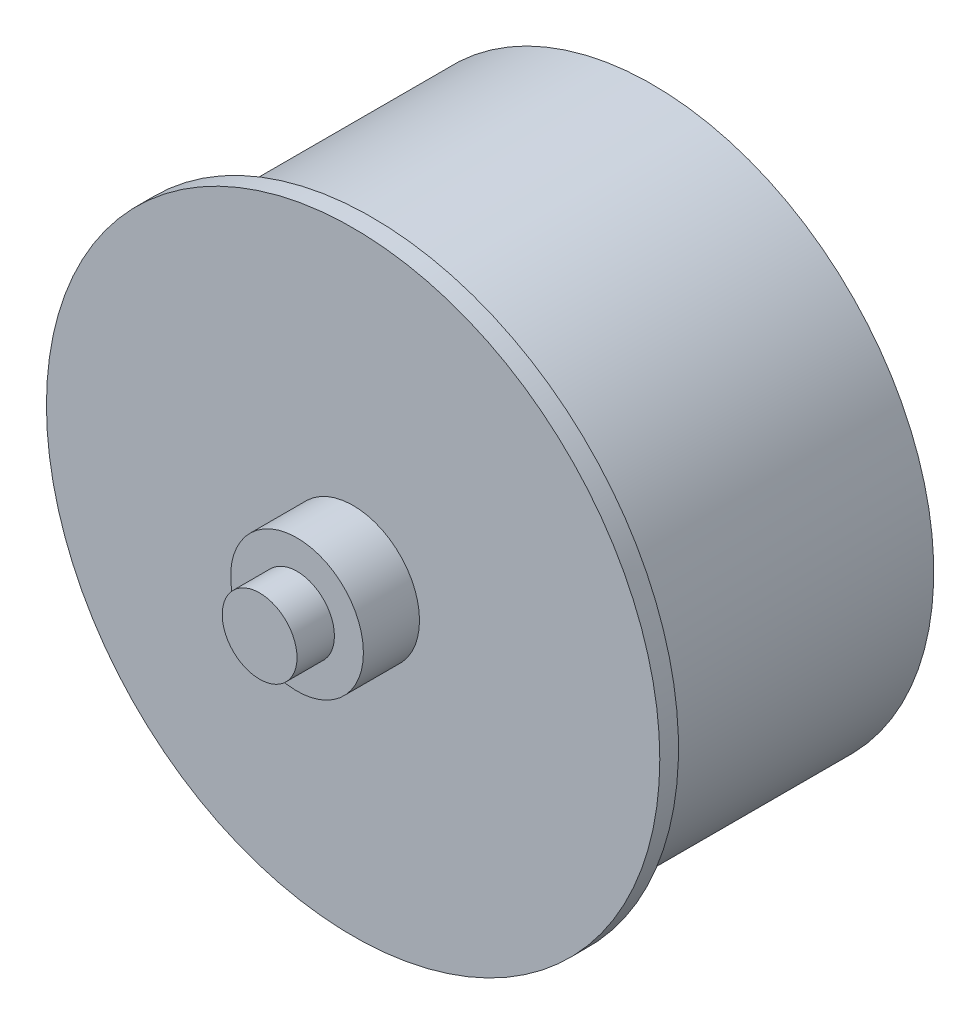
ISO-10303-21;
HEADER;
FILE_DESCRIPTION(('STEP AP214'),'2;1');
FILE_NAME('part.step','',(''),(''),'','','');
FILE_SCHEMA(('AUTOMOTIVE_DESIGN { 1 0 10303 214 1 1 1 1 }'));
ENDSEC;
DATA;
#1=APPLICATION_CONTEXT('core data for automotive mechanical design processes');
#2=APPLICATION_PROTOCOL_DEFINITION('international standard','automotive_design',2000,#1);
#3=PRODUCT_CONTEXT('',#1,'mechanical');
#4=PRODUCT('Part','Part','',(#3));
#5=PRODUCT_RELATED_PRODUCT_CATEGORY('part','',(#4));
#6=PRODUCT_DEFINITION_FORMATION('','',#4);
#7=PRODUCT_DEFINITION_CONTEXT('part definition',#1,'design');
#8=PRODUCT_DEFINITION('design','',#6,#7);
#9=PRODUCT_DEFINITION_SHAPE('','',#8);
#10=(LENGTH_UNIT() NAMED_UNIT(*) SI_UNIT(.MILLI.,.METRE.));
#11=(NAMED_UNIT(*) PLANE_ANGLE_UNIT() SI_UNIT($,.RADIAN.));
#12=(NAMED_UNIT(*) SI_UNIT($,.STERADIAN.) SOLID_ANGLE_UNIT());
#13=UNCERTAINTY_MEASURE_WITH_UNIT(LENGTH_MEASURE(1.E-05),#10,'distance_accuracy_value','');
#14=(GEOMETRIC_REPRESENTATION_CONTEXT(3) GLOBAL_UNCERTAINTY_ASSIGNED_CONTEXT((#13)) GLOBAL_UNIT_ASSIGNED_CONTEXT((#10,
#11,#12)) REPRESENTATION_CONTEXT('',''));
#15=CARTESIAN_POINT('',(0.,0.,0.));
#16=DIRECTION('',(0.,0.,1.));
#17=DIRECTION('',(1.,0.,0.));
#18=AXIS2_PLACEMENT_3D('',#15,#16,#17);
#19=CARTESIAN_POINT('',(0.,0.,-2.));
#20=DIRECTION('',(0.,0.,1.));
#21=DIRECTION('',(1.,0.,0.));
#22=AXIS2_PLACEMENT_3D('',#19,#20,#21);
#23=CYLINDRICAL_SURFACE('',#22,10.075);
#24=CARTESIAN_POINT('',(0.,0.,0.));
#25=DIRECTION('',(0.,0.,-1.));
#26=DIRECTION('',(-1.,0.,0.));
#27=AXIS2_PLACEMENT_3D('',#24,#25,#26);
#28=CIRCLE('',#27,10.075);
#29=CARTESIAN_POINT('',(-10.075,0.,0.));
#30=VERTEX_POINT('',#29);
#31=EDGE_CURVE('E11',#30,#30,#28,.T.);
#32=ORIENTED_EDGE('',*,*,#31,.T.);
#33=EDGE_LOOP('',(#32));
#34=FACE_BOUND('',#33,.T.);
#35=CARTESIAN_POINT('',(0.,0.,-1.));
#36=DIRECTION('',(0.,0.,-1.));
#37=DIRECTION('',(-1.,0.,0.));
#38=AXIS2_PLACEMENT_3D('',#35,#36,#37);
#39=CIRCLE('',#38,10.075);
#40=CARTESIAN_POINT('',(-10.075,0.,-1.));
#41=VERTEX_POINT('',#40);
#42=EDGE_CURVE('E87',#41,#41,#39,.T.);
#43=ORIENTED_EDGE('',*,*,#42,.F.);
#44=EDGE_LOOP('',(#43));
#45=FACE_BOUND('',#44,.T.);
#46=ADVANCED_FACE('F44',(#34,#45),#23,.T.);
#47=CARTESIAN_POINT('',(8.,0.,8.));
#48=DIRECTION('',(0.,0.,-1.));
#49=DIRECTION('',(-1.,0.,0.));
#50=AXIS2_PLACEMENT_3D('',#47,#48,#49);
#51=CYLINDRICAL_SURFACE('',#50,1.05);
#52=CARTESIAN_POINT('',(8.,0.,0.));
#53=DIRECTION('',(0.,0.,-1.));
#54=DIRECTION('',(-1.,0.,0.));
#55=AXIS2_PLACEMENT_3D('',#52,#53,#54);
#56=CIRCLE('',#55,1.05);
#57=CARTESIAN_POINT('',(6.95,0.,0.));
#58=VERTEX_POINT('',#57);
#59=EDGE_CURVE('E61',#58,#58,#56,.T.);
#60=ORIENTED_EDGE('',*,*,#59,.F.);
#61=EDGE_LOOP('',(#60));
#62=FACE_BOUND('',#61,.T.);
#63=CARTESIAN_POINT('',(8.,0.,-1.));
#64=DIRECTION('',(0.,0.,-1.));
#65=DIRECTION('',(-1.,0.,0.));
#66=AXIS2_PLACEMENT_3D('',#63,#64,#65);
#67=CIRCLE('',#66,1.05);
#68=CARTESIAN_POINT('',(6.95,0.,-1.));
#69=VERTEX_POINT('',#68);
#70=EDGE_CURVE('E59',#69,#69,#67,.F.);
#71=ORIENTED_EDGE('',*,*,#70,.F.);
#72=EDGE_LOOP('',(#71));
#73=FACE_BOUND('',#72,.T.);
#74=ADVANCED_FACE('F96',(#62,#73),#51,.F.);
#75=CARTESIAN_POINT('',(0.,-8.,8.));
#76=DIRECTION('',(0.,0.,-1.));
#77=DIRECTION('',(-1.,0.,0.));
#78=AXIS2_PLACEMENT_3D('',#75,#76,#77);
#79=CYLINDRICAL_SURFACE('',#78,1.05);
#80=CARTESIAN_POINT('',(0.,-8.,0.));
#81=DIRECTION('',(0.,0.,-1.));
#82=DIRECTION('',(-1.,0.,0.));
#83=AXIS2_PLACEMENT_3D('',#80,#81,#82);
#84=CIRCLE('',#83,1.05);
#85=CARTESIAN_POINT('',(-1.04999999999994,-8.,0.));
#86=VERTEX_POINT('',#85);
#87=EDGE_CURVE('E64',#86,#86,#84,.T.);
#88=ORIENTED_EDGE('',*,*,#87,.F.);
#89=EDGE_LOOP('',(#88));
#90=FACE_BOUND('',#89,.T.);
#91=CARTESIAN_POINT('',(0.,-8.,-1.));
#92=DIRECTION('',(0.,0.,-1.));
#93=DIRECTION('',(-1.,0.,0.));
#94=AXIS2_PLACEMENT_3D('',#91,#92,#93);
#95=CIRCLE('',#94,1.05);
#96=CARTESIAN_POINT('',(-1.04999999999994,-8.,-1.));
#97=VERTEX_POINT('',#96);
#98=EDGE_CURVE('E83',#97,#97,#95,.F.);
#99=ORIENTED_EDGE('',*,*,#98,.F.);
#100=EDGE_LOOP('',(#99));
#101=FACE_BOUND('',#100,.T.);
#102=ADVANCED_FACE('F77',(#90,#101),#79,.F.);
#103=CARTESIAN_POINT('',(-8.,0.,8.));
#104=DIRECTION('',(0.,0.,-1.));
#105=DIRECTION('',(-1.,0.,0.));
#106=AXIS2_PLACEMENT_3D('',#103,#104,#105);
#107=CYLINDRICAL_SURFACE('',#106,1.05);
#108=CARTESIAN_POINT('',(-8.,0.,0.));
#109=DIRECTION('',(0.,0.,-1.));
#110=DIRECTION('',(-1.,0.,0.));
#111=AXIS2_PLACEMENT_3D('',#108,#109,#110);
#112=CIRCLE('',#111,1.05);
#113=CARTESIAN_POINT('',(-9.05,0.,0.));
#114=VERTEX_POINT('',#113);
#115=EDGE_CURVE('E56',#114,#114,#112,.T.);
#116=ORIENTED_EDGE('',*,*,#115,.F.);
#117=EDGE_LOOP('',(#116));
#118=FACE_BOUND('',#117,.T.);
#119=CARTESIAN_POINT('',(-8.,0.,-1.));
#120=DIRECTION('',(0.,0.,-1.));
#121=DIRECTION('',(-1.,0.,0.));
#122=AXIS2_PLACEMENT_3D('',#119,#120,#121);
#123=CIRCLE('',#122,1.05);
#124=CARTESIAN_POINT('',(-9.05,0.,-1.));
#125=VERTEX_POINT('',#124);
#126=EDGE_CURVE('E81',#125,#125,#123,.F.);
#127=ORIENTED_EDGE('',*,*,#126,.F.);
#128=EDGE_LOOP('',(#127));
#129=FACE_BOUND('',#128,.T.);
#130=ADVANCED_FACE('F73',(#118,#129),#107,.F.);
#131=CARTESIAN_POINT('',(0.,8.,8.));
#132=DIRECTION('',(0.,0.,-1.));
#133=DIRECTION('',(-1.,0.,0.));
#134=AXIS2_PLACEMENT_3D('',#131,#132,#133);
#135=CYLINDRICAL_SURFACE('',#134,1.05);
#136=CARTESIAN_POINT('',(0.,8.,0.));
#137=DIRECTION('',(0.,0.,-1.));
#138=DIRECTION('',(-1.,0.,0.));
#139=AXIS2_PLACEMENT_3D('',#136,#137,#138);
#140=CIRCLE('',#139,1.05);
#141=CARTESIAN_POINT('',(-1.05,8.,0.));
#142=VERTEX_POINT('',#141);
#143=EDGE_CURVE('E51',#142,#142,#140,.T.);
#144=ORIENTED_EDGE('',*,*,#143,.F.);
#145=EDGE_LOOP('',(#144));
#146=FACE_BOUND('',#145,.T.);
#147=CARTESIAN_POINT('',(0.,8.,-1.));
#148=DIRECTION('',(0.,0.,-1.));
#149=DIRECTION('',(-1.,0.,0.));
#150=AXIS2_PLACEMENT_3D('',#147,#148,#149);
#151=CIRCLE('',#150,1.05);
#152=CARTESIAN_POINT('',(-1.05,8.,-1.));
#153=VERTEX_POINT('',#152);
#154=EDGE_CURVE('E47',#153,#153,#151,.F.);
#155=ORIENTED_EDGE('',*,*,#154,.F.);
#156=EDGE_LOOP('',(#155));
#157=FACE_BOUND('',#156,.T.);
#158=ADVANCED_FACE('F76',(#146,#157),#135,.F.);
#159=CARTESIAN_POINT('',(0.,0.,0.));
#160=DIRECTION('',(0.,0.,-1.));
#161=DIRECTION('',(-1.,0.,0.));
#162=AXIS2_PLACEMENT_3D('',#159,#160,#161);
#163=PLANE('',#162);
#164=ORIENTED_EDGE('',*,*,#143,.T.);
#165=EDGE_LOOP('',(#164));
#166=FACE_BOUND('',#165,.T.);
#167=ORIENTED_EDGE('',*,*,#115,.T.);
#168=EDGE_LOOP('',(#167));
#169=FACE_BOUND('',#168,.T.);
#170=ORIENTED_EDGE('',*,*,#87,.T.);
#171=EDGE_LOOP('',(#170));
#172=FACE_BOUND('',#171,.T.);
#173=ORIENTED_EDGE('',*,*,#59,.T.);
#174=EDGE_LOOP('',(#173));
#175=FACE_BOUND('',#174,.T.);
#176=ORIENTED_EDGE('',*,*,#31,.F.);
#177=EDGE_LOOP('',(#176));
#178=FACE_BOUND('',#177,.T.);
#179=ADVANCED_FACE('F70',(#166,#169,#172,#175,#178),#163,.F.);
#180=CARTESIAN_POINT('',(0.,0.,-1.));
#181=DIRECTION('',(0.,0.,-1.));
#182=DIRECTION('',(-1.,0.,0.));
#183=AXIS2_PLACEMENT_3D('',#180,#181,#182);
#184=PLANE('',#183);
#185=ORIENTED_EDGE('',*,*,#42,.T.);
#186=EDGE_LOOP('',(#185));
#187=FACE_BOUND('',#186,.T.);
#188=ORIENTED_EDGE('',*,*,#154,.T.);
#189=EDGE_LOOP('',(#188));
#190=FACE_BOUND('',#189,.T.);
#191=ORIENTED_EDGE('',*,*,#126,.T.);
#192=EDGE_LOOP('',(#191));
#193=FACE_BOUND('',#192,.T.);
#194=ORIENTED_EDGE('',*,*,#98,.T.);
#195=EDGE_LOOP('',(#194));
#196=FACE_BOUND('',#195,.T.);
#197=ORIENTED_EDGE('',*,*,#70,.T.);
#198=EDGE_LOOP('',(#197));
#199=FACE_BOUND('',#198,.T.);
#200=ADVANCED_FACE('F92',(#187,#190,#193,#196,#199),#184,.T.);
#201=CLOSED_SHELL('',(#46,#74,#102,#130,#158,#179,#200));
#202=MANIFOLD_SOLID_BREP('B2',#201);
#203=CARTESIAN_POINT('',(0.,0.,17.));
#204=DIRECTION('',(0.,0.,-1.));
#205=DIRECTION('',(-1.,0.,0.));
#206=AXIS2_PLACEMENT_3D('',#203,#204,#205);
#207=CYLINDRICAL_SURFACE('',#206,16.4);
#208=CARTESIAN_POINT('',(0.,0.,17.));
#209=DIRECTION('',(0.,0.,1.));
#210=DIRECTION('',(1.,0.,0.));
#211=AXIS2_PLACEMENT_3D('',#208,#209,#210);
#212=CIRCLE('',#211,16.4);
#213=CARTESIAN_POINT('',(16.4,0.,17.));
#214=VERTEX_POINT('',#213);
#215=EDGE_CURVE('E183',#214,#214,#212,.T.);
#216=ORIENTED_EDGE('',*,*,#215,.F.);
#217=EDGE_LOOP('',(#216));
#218=FACE_BOUND('',#217,.T.);
#219=CARTESIAN_POINT('',(0.,0.,16.));
#220=DIRECTION('',(0.,0.,-1.));
#221=DIRECTION('',(-1.,0.,0.));
#222=AXIS2_PLACEMENT_3D('',#219,#220,#221);
#223=CIRCLE('',#222,16.4);
#224=CARTESIAN_POINT('',(-16.4,0.,16.));
#225=VERTEX_POINT('',#224);
#226=EDGE_CURVE('E193',#225,#225,#223,.T.);
#227=ORIENTED_EDGE('',*,*,#226,.F.);
#228=EDGE_LOOP('',(#227));
#229=FACE_BOUND('',#228,.T.);
#230=ADVANCED_FACE('F169',(#218,#229),#207,.T.);
#231=CARTESIAN_POINT('',(0.,0.,17.));
#232=DIRECTION('',(0.,0.,1.));
#233=DIRECTION('',(1.,0.,0.));
#234=AXIS2_PLACEMENT_3D('',#231,#232,#233);
#235=PLANE('',#234);
#236=CARTESIAN_POINT('',(0.,0.,17.));
#237=DIRECTION('',(0.,0.,1.));
#238=DIRECTION('',(1.,0.,0.));
#239=AXIS2_PLACEMENT_3D('',#236,#237,#238);
#240=CIRCLE('',#239,3.55);
#241=CARTESIAN_POINT('',(3.55,0.,17.));
#242=VERTEX_POINT('',#241);
#243=EDGE_CURVE('E177',#242,#242,#240,.T.);
#244=ORIENTED_EDGE('',*,*,#243,.F.);
#245=EDGE_LOOP('',(#244));
#246=FACE_BOUND('',#245,.T.);
#247=ORIENTED_EDGE('',*,*,#215,.T.);
#248=EDGE_LOOP('',(#247));
#249=FACE_BOUND('',#248,.T.);
#250=ADVANCED_FACE('F260',(#246,#249),#235,.T.);
#251=CARTESIAN_POINT('',(0.,0.,20.));
#252=DIRECTION('',(0.,0.,-1.));
#253=DIRECTION('',(-1.,0.,0.));
#254=AXIS2_PLACEMENT_3D('',#251,#252,#253);
#255=CYLINDRICAL_SURFACE('',#254,3.55);
#256=CARTESIAN_POINT('',(0.,0.,20.));
#257=DIRECTION('',(0.,0.,1.));
#258=DIRECTION('',(1.,0.,0.));
#259=AXIS2_PLACEMENT_3D('',#256,#257,#258);
#260=CIRCLE('',#259,3.55);
#261=CARTESIAN_POINT('',(3.55,0.,20.));
#262=VERTEX_POINT('',#261);
#263=EDGE_CURVE('E218',#262,#262,#260,.T.);
#264=ORIENTED_EDGE('',*,*,#263,.F.);
#265=EDGE_LOOP('',(#264));
#266=FACE_BOUND('',#265,.T.);
#267=ORIENTED_EDGE('',*,*,#243,.T.);
#268=EDGE_LOOP('',(#267));
#269=FACE_BOUND('',#268,.T.);
#270=ADVANCED_FACE('F265',(#266,#269),#255,.T.);
#271=CARTESIAN_POINT('',(0.,0.,20.));
#272=DIRECTION('',(0.,0.,1.));
#273=DIRECTION('',(1.,0.,0.));
#274=AXIS2_PLACEMENT_3D('',#271,#272,#273);
#275=PLANE('',#274);
#276=CARTESIAN_POINT('',(0.,0.,20.));
#277=DIRECTION('',(0.,0.,1.));
#278=DIRECTION('',(1.,0.,0.));
#279=AXIS2_PLACEMENT_3D('',#276,#277,#278);
#280=CIRCLE('',#279,2.);
#281=CARTESIAN_POINT('',(2.,0.,20.));
#282=VERTEX_POINT('',#281);
#283=EDGE_CURVE('E43',#282,#282,#280,.T.);
#284=ORIENTED_EDGE('',*,*,#283,.F.);
#285=EDGE_LOOP('',(#284));
#286=FACE_BOUND('',#285,.T.);
#287=ORIENTED_EDGE('',*,*,#263,.T.);
#288=EDGE_LOOP('',(#287));
#289=FACE_BOUND('',#288,.T.);
#290=ADVANCED_FACE('F276',(#286,#289),#275,.T.);
#291=CARTESIAN_POINT('',(0.,0.,16.));
#292=DIRECTION('',(0.,0.,-1.));
#293=DIRECTION('',(-1.,0.,0.));
#294=AXIS2_PLACEMENT_3D('',#291,#292,#293);
#295=PLANE('',#294);
#296=ORIENTED_EDGE('',*,*,#226,.T.);
#297=EDGE_LOOP('',(#296));
#298=FACE_BOUND('',#297,.T.);
#299=CARTESIAN_POINT('',(0.,0.,16.));
#300=DIRECTION('',(0.,0.,-1.));
#301=DIRECTION('',(-1.,0.,0.));
#302=AXIS2_PLACEMENT_3D('',#299,#300,#301);
#303=CIRCLE('',#302,15.05);
#304=CARTESIAN_POINT('',(-15.05,0.,16.));
#305=VERTEX_POINT('',#304);
#306=EDGE_CURVE('E280',#305,#305,#303,.F.);
#307=ORIENTED_EDGE('',*,*,#306,.T.);
#308=EDGE_LOOP('',(#307));
#309=FACE_BOUND('',#308,.T.);
#310=ADVANCED_FACE('F272',(#298,#309),#295,.T.);
#311=CARTESIAN_POINT('',(0.,0.,22.));
#312=DIRECTION('',(0.,0.,-1.));
#313=DIRECTION('',(-1.,0.,0.));
#314=AXIS2_PLACEMENT_3D('',#311,#312,#313);
#315=CYLINDRICAL_SURFACE('',#314,2.);
#316=CARTESIAN_POINT('',(0.,0.,22.));
#317=DIRECTION('',(0.,0.,1.));
#318=DIRECTION('',(1.,0.,0.));
#319=AXIS2_PLACEMENT_3D('',#316,#317,#318);
#320=CIRCLE('',#319,2.);
#321=CARTESIAN_POINT('',(2.,0.,22.));
#322=VERTEX_POINT('',#321);
#323=EDGE_CURVE('E187',#322,#322,#320,.T.);
#324=ORIENTED_EDGE('',*,*,#323,.F.);
#325=EDGE_LOOP('',(#324));
#326=FACE_BOUND('',#325,.T.);
#327=ORIENTED_EDGE('',*,*,#283,.T.);
#328=EDGE_LOOP('',(#327));
#329=FACE_BOUND('',#328,.T.);
#330=ADVANCED_FACE('F275',(#326,#329),#315,.T.);
#331=CARTESIAN_POINT('',(0.,0.,22.));
#332=DIRECTION('',(0.,0.,1.));
#333=DIRECTION('',(1.,0.,0.));
#334=AXIS2_PLACEMENT_3D('',#331,#332,#333);
#335=PLANE('',#334);
#336=ORIENTED_EDGE('',*,*,#323,.T.);
#337=EDGE_LOOP('',(#336));
#338=FACE_BOUND('',#337,.T.);
#339=ADVANCED_FACE('F296',(#338),#335,.T.);
#340=CARTESIAN_POINT('',(0.,0.,58.6385389055488));
#341=DIRECTION('',(0.,0.,-1.));
#342=DIRECTION('',(-1.,0.,0.));
#343=AXIS2_PLACEMENT_3D('',#340,#341,#342);
#344=CYLINDRICAL_SURFACE('',#343,15.05);
#345=ORIENTED_EDGE('',*,*,#306,.F.);
#346=EDGE_LOOP('',(#345));
#347=FACE_BOUND('',#346,.T.);
#348=CARTESIAN_POINT('',(0.,0.,1.));
#349=DIRECTION('',(0.,0.,-1.));
#350=DIRECTION('',(-1.,0.,0.));
#351=AXIS2_PLACEMENT_3D('',#348,#349,#350);
#352=CIRCLE('',#351,15.05);
#353=CARTESIAN_POINT('',(-15.05,0.,1.));
#354=VERTEX_POINT('',#353);
#355=EDGE_CURVE('E283',#354,#354,#352,.T.);
#356=ORIENTED_EDGE('',*,*,#355,.F.);
#357=EDGE_LOOP('',(#356));
#358=FACE_BOUND('',#357,.T.);
#359=ADVANCED_FACE('F293',(#347,#358),#344,.T.);
#360=CARTESIAN_POINT('',(0.,0.,8.));
#361=DIRECTION('',(0.,0.,-1.));
#362=DIRECTION('',(-1.,0.,0.));
#363=AXIS2_PLACEMENT_3D('',#360,#361,#362);
#364=PLANE('',#363);
#365=CARTESIAN_POINT('',(8.,0.,8.));
#366=DIRECTION('',(0.,0.,-1.));
#367=DIRECTION('',(-1.,0.,0.));
#368=AXIS2_PLACEMENT_3D('',#365,#366,#367);
#369=CIRCLE('',#368,1.05);
#370=CARTESIAN_POINT('',(6.95,0.,8.));
#371=VERTEX_POINT('',#370);
#372=EDGE_CURVE('E201',#371,#371,#369,.T.);
#373=ORIENTED_EDGE('',*,*,#372,.T.);
#374=EDGE_LOOP('',(#373));
#375=FACE_BOUND('',#374,.T.);
#376=ADVANCED_FACE('F295',(#375),#364,.T.);
#377=CARTESIAN_POINT('',(0.,0.,8.));
#378=DIRECTION('',(0.,0.,-1.));
#379=DIRECTION('',(-1.,0.,0.));
#380=AXIS2_PLACEMENT_3D('',#377,#378,#379);
#381=PLANE('',#380);
#382=CARTESIAN_POINT('',(0.,-8.,8.));
#383=DIRECTION('',(0.,0.,-1.));
#384=DIRECTION('',(-1.,0.,0.));
#385=AXIS2_PLACEMENT_3D('',#382,#383,#384);
#386=CIRCLE('',#385,1.05);
#387=CARTESIAN_POINT('',(-1.04999999999994,-8.,8.));
#388=VERTEX_POINT('',#387);
#389=EDGE_CURVE('E211',#388,#388,#386,.T.);
#390=ORIENTED_EDGE('',*,*,#389,.T.);
#391=EDGE_LOOP('',(#390));
#392=FACE_BOUND('',#391,.T.);
#393=ADVANCED_FACE('F301',(#392),#381,.T.);
#394=CARTESIAN_POINT('',(0.,0.,8.));
#395=DIRECTION('',(0.,0.,-1.));
#396=DIRECTION('',(-1.,0.,0.));
#397=AXIS2_PLACEMENT_3D('',#394,#395,#396);
#398=PLANE('',#397);
#399=CARTESIAN_POINT('',(-8.,0.,8.));
#400=DIRECTION('',(0.,0.,-1.));
#401=DIRECTION('',(-1.,0.,0.));
#402=AXIS2_PLACEMENT_3D('',#399,#400,#401);
#403=CIRCLE('',#402,1.05);
#404=CARTESIAN_POINT('',(-9.05,0.,8.));
#405=VERTEX_POINT('',#404);
#406=EDGE_CURVE('E207',#405,#405,#403,.T.);
#407=ORIENTED_EDGE('',*,*,#406,.T.);
#408=EDGE_LOOP('',(#407));
#409=FACE_BOUND('',#408,.T.);
#410=ADVANCED_FACE('F318',(#409),#398,.T.);
#411=CARTESIAN_POINT('',(0.,0.,8.));
#412=DIRECTION('',(0.,0.,-1.));
#413=DIRECTION('',(-1.,0.,0.));
#414=AXIS2_PLACEMENT_3D('',#411,#412,#413);
#415=PLANE('',#414);
#416=CARTESIAN_POINT('',(0.,8.,8.));
#417=DIRECTION('',(0.,0.,-1.));
#418=DIRECTION('',(-1.,0.,0.));
#419=AXIS2_PLACEMENT_3D('',#416,#417,#418);
#420=CIRCLE('',#419,1.05);
#421=CARTESIAN_POINT('',(-1.05,8.,8.));
#422=VERTEX_POINT('',#421);
#423=EDGE_CURVE('E202',#422,#422,#420,.T.);
#424=ORIENTED_EDGE('',*,*,#423,.T.);
#425=EDGE_LOOP('',(#424));
#426=FACE_BOUND('',#425,.T.);
#427=ADVANCED_FACE('F315',(#426),#415,.T.);
#428=CARTESIAN_POINT('',(8.,0.,8.));
#429=DIRECTION('',(0.,0.,-1.));
#430=DIRECTION('',(-1.,0.,0.));
#431=AXIS2_PLACEMENT_3D('',#428,#429,#430);
#432=CYLINDRICAL_SURFACE('',#431,1.05);
#433=ORIENTED_EDGE('',*,*,#372,.F.);
#434=EDGE_LOOP('',(#433));
#435=FACE_BOUND('',#434,.T.);
#436=CARTESIAN_POINT('',(8.,0.,0.));
#437=DIRECTION('',(0.,0.,1.));
#438=DIRECTION('',(1.,0.,0.));
#439=AXIS2_PLACEMENT_3D('',#436,#437,#438);
#440=CIRCLE('',#439,1.05);
#441=CARTESIAN_POINT('',(9.05,0.,0.));
#442=VERTEX_POINT('',#441);
#443=EDGE_CURVE('E206',#442,#442,#440,.T.);
#444=ORIENTED_EDGE('',*,*,#443,.F.);
#445=EDGE_LOOP('',(#444));
#446=FACE_BOUND('',#445,.T.);
#447=ADVANCED_FACE('F317',(#435,#446),#432,.F.);
#448=CARTESIAN_POINT('',(0.,-8.,8.));
#449=DIRECTION('',(0.,0.,-1.));
#450=DIRECTION('',(-1.,0.,0.));
#451=AXIS2_PLACEMENT_3D('',#448,#449,#450);
#452=CYLINDRICAL_SURFACE('',#451,1.05);
#453=ORIENTED_EDGE('',*,*,#389,.F.);
#454=EDGE_LOOP('',(#453));
#455=FACE_BOUND('',#454,.T.);
#456=CARTESIAN_POINT('',(0.,-8.,0.));
#457=DIRECTION('',(0.,0.,1.));
#458=DIRECTION('',(1.,0.,0.));
#459=AXIS2_PLACEMENT_3D('',#456,#457,#458);
#460=CIRCLE('',#459,1.05);
#461=CARTESIAN_POINT('',(1.05000000000006,-8.,0.));
#462=VERTEX_POINT('',#461);
#463=EDGE_CURVE('E228',#462,#462,#460,.T.);
#464=ORIENTED_EDGE('',*,*,#463,.F.);
#465=EDGE_LOOP('',(#464));
#466=FACE_BOUND('',#465,.T.);
#467=ADVANCED_FACE('F253',(#455,#466),#452,.F.);
#468=CARTESIAN_POINT('',(-8.,0.,8.));
#469=DIRECTION('',(0.,0.,-1.));
#470=DIRECTION('',(-1.,0.,0.));
#471=AXIS2_PLACEMENT_3D('',#468,#469,#470);
#472=CYLINDRICAL_SURFACE('',#471,1.05);
#473=ORIENTED_EDGE('',*,*,#406,.F.);
#474=EDGE_LOOP('',(#473));
#475=FACE_BOUND('',#474,.T.);
#476=CARTESIAN_POINT('',(-8.,0.,0.));
#477=DIRECTION('',(0.,0.,1.));
#478=DIRECTION('',(1.,0.,0.));
#479=AXIS2_PLACEMENT_3D('',#476,#477,#478);
#480=CIRCLE('',#479,1.05);
#481=CARTESIAN_POINT('',(-6.95,0.,0.));
#482=VERTEX_POINT('',#481);
#483=EDGE_CURVE('E231',#482,#482,#480,.T.);
#484=ORIENTED_EDGE('',*,*,#483,.F.);
#485=EDGE_LOOP('',(#484));
#486=FACE_BOUND('',#485,.T.);
#487=ADVANCED_FACE('F244',(#475,#486),#472,.F.);
#488=CARTESIAN_POINT('',(0.,8.,8.));
#489=DIRECTION('',(0.,0.,-1.));
#490=DIRECTION('',(-1.,0.,0.));
#491=AXIS2_PLACEMENT_3D('',#488,#489,#490);
#492=CYLINDRICAL_SURFACE('',#491,1.05);
#493=ORIENTED_EDGE('',*,*,#423,.F.);
#494=EDGE_LOOP('',(#493));
#495=FACE_BOUND('',#494,.T.);
#496=CARTESIAN_POINT('',(0.,8.,0.));
#497=DIRECTION('',(0.,0.,1.));
#498=DIRECTION('',(1.,0.,0.));
#499=AXIS2_PLACEMENT_3D('',#496,#497,#498);
#500=CIRCLE('',#499,1.05);
#501=CARTESIAN_POINT('',(1.05,8.,0.));
#502=VERTEX_POINT('',#501);
#503=EDGE_CURVE('E172',#502,#502,#500,.T.);
#504=ORIENTED_EDGE('',*,*,#503,.F.);
#505=EDGE_LOOP('',(#504));
#506=FACE_BOUND('',#505,.T.);
#507=ADVANCED_FACE('F242',(#495,#506),#492,.F.);
#508=CARTESIAN_POINT('',(0.,0.,0.));
#509=DIRECTION('',(0.,0.,1.));
#510=DIRECTION('',(1.,0.,0.));
#511=AXIS2_PLACEMENT_3D('',#508,#509,#510);
#512=PLANE('',#511);
#513=ORIENTED_EDGE('',*,*,#503,.T.);
#514=EDGE_LOOP('',(#513));
#515=FACE_BOUND('',#514,.T.);
#516=ORIENTED_EDGE('',*,*,#483,.T.);
#517=EDGE_LOOP('',(#516));
#518=FACE_BOUND('',#517,.T.);
#519=ORIENTED_EDGE('',*,*,#463,.T.);
#520=EDGE_LOOP('',(#519));
#521=FACE_BOUND('',#520,.T.);
#522=ORIENTED_EDGE('',*,*,#443,.T.);
#523=EDGE_LOOP('',(#522));
#524=FACE_BOUND('',#523,.T.);
#525=CARTESIAN_POINT('',(0.,0.,0.));
#526=DIRECTION('',(0.,0.,-1.));
#527=DIRECTION('',(-1.,0.,0.));
#528=AXIS2_PLACEMENT_3D('',#525,#526,#527);
#529=CIRCLE('',#528,10.075);
#530=CARTESIAN_POINT('',(-10.075,0.,0.));
#531=VERTEX_POINT('',#530);
#532=EDGE_CURVE('E194',#531,#531,#529,.T.);
#533=ORIENTED_EDGE('',*,*,#532,.T.);
#534=EDGE_LOOP('',(#533));
#535=FACE_BOUND('',#534,.T.);
#536=ADVANCED_FACE('F240',(#515,#518,#521,#524,#535),#512,.F.);
#537=CARTESIAN_POINT('',(0.,0.,1.));
#538=DIRECTION('',(0.,0.,-1.));
#539=DIRECTION('',(-1.,0.,0.));
#540=AXIS2_PLACEMENT_3D('',#537,#538,#539);
#541=CYLINDRICAL_SURFACE('',#540,10.075);
#542=CARTESIAN_POINT('',(0.,0.,1.));
#543=DIRECTION('',(0.,0.,-1.));
#544=DIRECTION('',(-1.,0.,0.));
#545=AXIS2_PLACEMENT_3D('',#542,#543,#544);
#546=CIRCLE('',#545,10.075);
#547=CARTESIAN_POINT('',(-10.075,0.,1.));
#548=VERTEX_POINT('',#547);
#549=EDGE_CURVE('E189',#548,#548,#546,.T.);
#550=ORIENTED_EDGE('',*,*,#549,.T.);
#551=EDGE_LOOP('',(#550));
#552=FACE_BOUND('',#551,.T.);
#553=ORIENTED_EDGE('',*,*,#532,.F.);
#554=EDGE_LOOP('',(#553));
#555=FACE_BOUND('',#554,.T.);
#556=ADVANCED_FACE('F252',(#552,#555),#541,.T.);
#557=CARTESIAN_POINT('',(0.,0.,1.));
#558=DIRECTION('',(0.,0.,-1.));
#559=DIRECTION('',(-1.,0.,0.));
#560=AXIS2_PLACEMENT_3D('',#557,#558,#559);
#561=PLANE('',#560);
#562=ORIENTED_EDGE('',*,*,#549,.F.);
#563=EDGE_LOOP('',(#562));
#564=FACE_BOUND('',#563,.T.);
#565=ORIENTED_EDGE('',*,*,#355,.T.);
#566=EDGE_LOOP('',(#565));
#567=FACE_BOUND('',#566,.T.);
#568=ADVANCED_FACE('F291',(#564,#567),#561,.T.);
#569=CLOSED_SHELL('',(#230,#250,#270,#290,#310,#330,#339,#359,#376,#393,#410,#427,#447,#467,
#487,#507,#536,#556,#568));
#570=MANIFOLD_SOLID_BREP('B6',#569);
#571=ADVANCED_BREP_SHAPE_REPRESENTATION('',(#18,#202,#570),#14);
#572=SHAPE_DEFINITION_REPRESENTATION(#9,#571);
ENDSEC;
END-ISO-10303-21;
